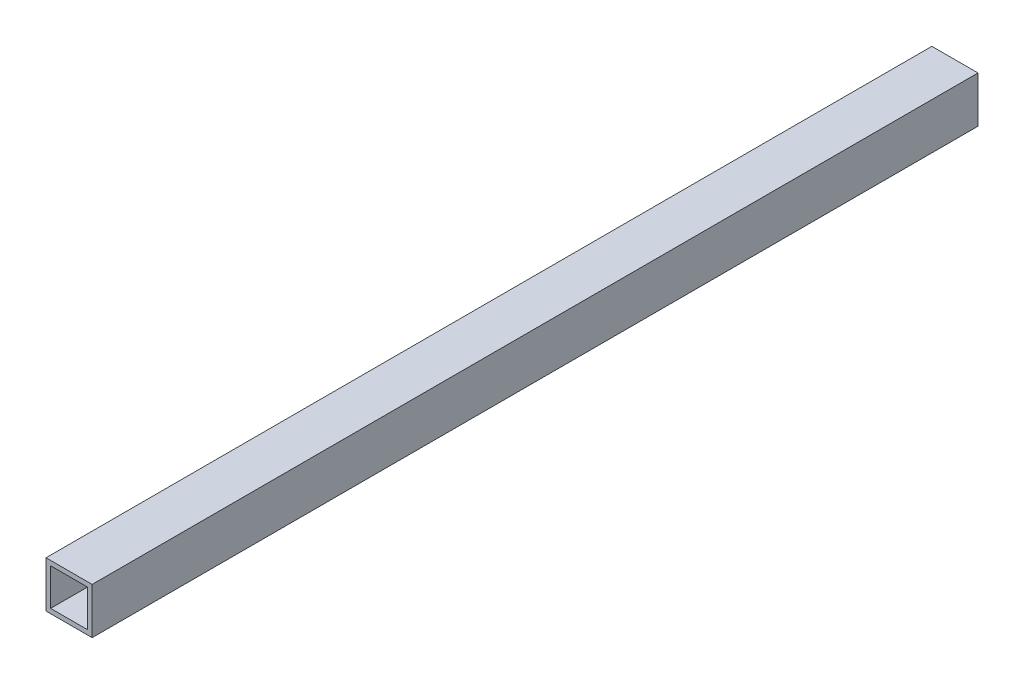
ISO-10303-21;
HEADER;
FILE_DESCRIPTION(('STEP AP214'),'2;1');
FILE_NAME('part.step','',(''),(''),'','','');
FILE_SCHEMA(('AUTOMOTIVE_DESIGN { 1 0 10303 214 1 1 1 1 }'));
ENDSEC;
DATA;
#1=APPLICATION_CONTEXT('core data for automotive mechanical design processes');
#2=APPLICATION_PROTOCOL_DEFINITION('international standard','automotive_design',2000,#1);
#3=PRODUCT_CONTEXT('',#1,'mechanical');
#4=PRODUCT('Part','Part','',(#3));
#5=PRODUCT_RELATED_PRODUCT_CATEGORY('part','',(#4));
#6=PRODUCT_DEFINITION_FORMATION('','',#4);
#7=PRODUCT_DEFINITION_CONTEXT('part definition',#1,'design');
#8=PRODUCT_DEFINITION('design','',#6,#7);
#9=PRODUCT_DEFINITION_SHAPE('','',#8);
#10=(LENGTH_UNIT() NAMED_UNIT(*) SI_UNIT(.MILLI.,.METRE.));
#11=(NAMED_UNIT(*) PLANE_ANGLE_UNIT() SI_UNIT($,.RADIAN.));
#12=(NAMED_UNIT(*) SI_UNIT($,.STERADIAN.) SOLID_ANGLE_UNIT());
#13=UNCERTAINTY_MEASURE_WITH_UNIT(LENGTH_MEASURE(1.E-05),#10,'distance_accuracy_value','');
#14=(GEOMETRIC_REPRESENTATION_CONTEXT(3) GLOBAL_UNCERTAINTY_ASSIGNED_CONTEXT((#13)) GLOBAL_UNIT_ASSIGNED_CONTEXT((#10,
#11,#12)) REPRESENTATION_CONTEXT('',''));
#15=CARTESIAN_POINT('',(0.,0.,0.));
#16=DIRECTION('',(0.,0.,1.));
#17=DIRECTION('',(1.,0.,0.));
#18=AXIS2_PLACEMENT_3D('',#15,#16,#17);
#19=CARTESIAN_POINT('',(31.75,31.75,0.));
#20=DIRECTION('',(0.,1.,0.));
#21=DIRECTION('',(0.,0.,1.));
#22=AXIS2_PLACEMENT_3D('',#19,#20,#21);
#23=PLANE('',#22);
#24=DIRECTION('',(0.,0.,-1.));
#25=VECTOR('',#24,1.);
#26=CARTESIAN_POINT('',(31.75,31.75,0.));
#27=LINE('',#26,#25);
#28=CARTESIAN_POINT('',(31.75,31.75,0.));
#29=VERTEX_POINT('',#28);
#30=CARTESIAN_POINT('',(31.75,31.75,609.6));
#31=VERTEX_POINT('',#30);
#32=EDGE_CURVE('E113',#29,#31,#27,.F.);
#33=ORIENTED_EDGE('',*,*,#32,.F.);
#34=DIRECTION('',(1.,0.,0.));
#35=VECTOR('',#34,1.);
#36=CARTESIAN_POINT('',(0.,31.75,0.));
#37=LINE('',#36,#35);
#38=CARTESIAN_POINT('',(0.,31.75,0.));
#39=VERTEX_POINT('',#38);
#40=EDGE_CURVE('E135',#29,#39,#37,.F.);
#41=ORIENTED_EDGE('',*,*,#40,.T.);
#42=DIRECTION('',(0.,0.,1.));
#43=VECTOR('',#42,1.);
#44=CARTESIAN_POINT('',(0.,31.75,0.));
#45=LINE('',#44,#43);
#46=CARTESIAN_POINT('',(0.,31.75,609.6));
#47=VERTEX_POINT('',#46);
#48=EDGE_CURVE('E143',#47,#39,#45,.F.);
#49=ORIENTED_EDGE('',*,*,#48,.F.);
#50=DIRECTION('',(1.,0.,0.));
#51=VECTOR('',#50,1.);
#52=CARTESIAN_POINT('',(0.,31.75,609.6));
#53=LINE('',#52,#51);
#54=EDGE_CURVE('E105',#31,#47,#53,.F.);
#55=ORIENTED_EDGE('',*,*,#54,.F.);
#56=EDGE_LOOP('',(#33,#41,#49,#55));
#57=FACE_BOUND('',#56,.T.);
#58=ADVANCED_FACE('F17',(#57),#23,.T.);
#59=CARTESIAN_POINT('',(0.,3.175,0.));
#60=DIRECTION('',(0.,-1.,0.));
#61=DIRECTION('',(0.,0.,-1.));
#62=AXIS2_PLACEMENT_3D('',#59,#60,#61);
#63=PLANE('',#62);
#64=DIRECTION('',(1.,0.,0.));
#65=VECTOR('',#64,1.);
#66=CARTESIAN_POINT('',(0.,3.175,609.6));
#67=LINE('',#66,#65);
#68=CARTESIAN_POINT('',(28.575,3.175,609.6));
#69=VERTEX_POINT('',#68);
#70=CARTESIAN_POINT('',(3.175,3.175,609.6));
#71=VERTEX_POINT('',#70);
#72=EDGE_CURVE('E104',#69,#71,#67,.F.);
#73=ORIENTED_EDGE('',*,*,#72,.F.);
#74=DIRECTION('',(0.,0.,-1.));
#75=VECTOR('',#74,1.);
#76=CARTESIAN_POINT('',(28.575,3.175,0.));
#77=LINE('',#76,#75);
#78=CARTESIAN_POINT('',(28.575,3.175,0.));
#79=VERTEX_POINT('',#78);
#80=EDGE_CURVE('E116',#69,#79,#77,.T.);
#81=ORIENTED_EDGE('',*,*,#80,.T.);
#82=DIRECTION('',(1.,0.,0.));
#83=VECTOR('',#82,1.);
#84=CARTESIAN_POINT('',(0.,3.175,0.));
#85=LINE('',#84,#83);
#86=CARTESIAN_POINT('',(3.175,3.175,0.));
#87=VERTEX_POINT('',#86);
#88=EDGE_CURVE('E122',#79,#87,#85,.F.);
#89=ORIENTED_EDGE('',*,*,#88,.T.);
#90=DIRECTION('',(0.,0.,1.));
#91=VECTOR('',#90,1.);
#92=CARTESIAN_POINT('',(3.175,3.175,0.));
#93=LINE('',#92,#91);
#94=EDGE_CURVE('E20',#87,#71,#93,.T.);
#95=ORIENTED_EDGE('',*,*,#94,.T.);
#96=EDGE_LOOP('',(#73,#81,#89,#95));
#97=FACE_BOUND('',#96,.T.);
#98=ADVANCED_FACE('F120',(#97),#63,.F.);
#99=CARTESIAN_POINT('',(3.175,31.75,0.));
#100=DIRECTION('',(-1.,0.,0.));
#101=DIRECTION('',(0.,0.,1.));
#102=AXIS2_PLACEMENT_3D('',#99,#100,#101);
#103=PLANE('',#102);
#104=DIRECTION('',(0.,1.,0.));
#105=VECTOR('',#104,1.);
#106=CARTESIAN_POINT('',(3.175,0.,609.6));
#107=LINE('',#106,#105);
#108=CARTESIAN_POINT('',(3.175,28.575,609.6));
#109=VERTEX_POINT('',#108);
#110=EDGE_CURVE('E85',#71,#109,#107,.T.);
#111=ORIENTED_EDGE('',*,*,#110,.F.);
#112=ORIENTED_EDGE('',*,*,#94,.F.);
#113=DIRECTION('',(0.,1.,0.));
#114=VECTOR('',#113,1.);
#115=CARTESIAN_POINT('',(3.175,0.,0.));
#116=LINE('',#115,#114);
#117=CARTESIAN_POINT('',(3.175,28.575,0.));
#118=VERTEX_POINT('',#117);
#119=EDGE_CURVE('E88',#87,#118,#116,.T.);
#120=ORIENTED_EDGE('',*,*,#119,.T.);
#121=DIRECTION('',(0.,0.,1.));
#122=VECTOR('',#121,1.);
#123=CARTESIAN_POINT('',(3.175,28.575,0.));
#124=LINE('',#123,#122);
#125=EDGE_CURVE('E80',#118,#109,#124,.T.);
#126=ORIENTED_EDGE('',*,*,#125,.T.);
#127=EDGE_LOOP('',(#111,#112,#120,#126));
#128=FACE_BOUND('',#127,.T.);
#129=ADVANCED_FACE('F82',(#128),#103,.F.);
#130=CARTESIAN_POINT('',(31.75,28.575,0.));
#131=DIRECTION('',(0.,1.,0.));
#132=DIRECTION('',(0.,0.,1.));
#133=AXIS2_PLACEMENT_3D('',#130,#131,#132);
#134=PLANE('',#133);
#135=DIRECTION('',(1.,0.,0.));
#136=VECTOR('',#135,1.);
#137=CARTESIAN_POINT('',(0.,28.575,609.6));
#138=LINE('',#137,#136);
#139=CARTESIAN_POINT('',(28.575,28.575,609.6));
#140=VERTEX_POINT('',#139);
#141=EDGE_CURVE('E93',#109,#140,#138,.T.);
#142=ORIENTED_EDGE('',*,*,#141,.F.);
#143=ORIENTED_EDGE('',*,*,#125,.F.);
#144=DIRECTION('',(1.,0.,0.));
#145=VECTOR('',#144,1.);
#146=CARTESIAN_POINT('',(0.,28.575,0.));
#147=LINE('',#146,#145);
#148=CARTESIAN_POINT('',(28.575,28.575,0.));
#149=VERTEX_POINT('',#148);
#150=EDGE_CURVE('E129',#118,#149,#147,.T.);
#151=ORIENTED_EDGE('',*,*,#150,.T.);
#152=DIRECTION('',(0.,0.,-1.));
#153=VECTOR('',#152,1.);
#154=CARTESIAN_POINT('',(28.575,28.575,0.));
#155=LINE('',#154,#153);
#156=EDGE_CURVE('E91',#149,#140,#155,.F.);
#157=ORIENTED_EDGE('',*,*,#156,.T.);
#158=EDGE_LOOP('',(#142,#143,#151,#157));
#159=FACE_BOUND('',#158,.T.);
#160=ADVANCED_FACE('F94',(#159),#134,.F.);
#161=CARTESIAN_POINT('',(28.575,0.,0.));
#162=DIRECTION('',(1.,0.,0.));
#163=DIRECTION('',(0.,0.,-1.));
#164=AXIS2_PLACEMENT_3D('',#161,#162,#163);
#165=PLANE('',#164);
#166=DIRECTION('',(0.,1.,0.));
#167=VECTOR('',#166,1.);
#168=CARTESIAN_POINT('',(28.575,0.,609.6));
#169=LINE('',#168,#167);
#170=EDGE_CURVE('E99',#140,#69,#169,.F.);
#171=ORIENTED_EDGE('',*,*,#170,.F.);
#172=ORIENTED_EDGE('',*,*,#156,.F.);
#173=DIRECTION('',(0.,1.,0.));
#174=VECTOR('',#173,1.);
#175=CARTESIAN_POINT('',(28.575,0.,0.));
#176=LINE('',#175,#174);
#177=EDGE_CURVE('E125',#149,#79,#176,.F.);
#178=ORIENTED_EDGE('',*,*,#177,.T.);
#179=ORIENTED_EDGE('',*,*,#80,.F.);
#180=EDGE_LOOP('',(#171,#172,#178,#179));
#181=FACE_BOUND('',#180,.T.);
#182=ADVANCED_FACE('F126',(#181),#165,.F.);
#183=CARTESIAN_POINT('',(31.75,0.,0.));
#184=DIRECTION('',(1.,0.,0.));
#185=DIRECTION('',(0.,0.,-1.));
#186=AXIS2_PLACEMENT_3D('',#183,#184,#185);
#187=PLANE('',#186);
#188=DIRECTION('',(0.,0.,-1.));
#189=VECTOR('',#188,1.);
#190=CARTESIAN_POINT('',(31.75,0.,0.));
#191=LINE('',#190,#189);
#192=CARTESIAN_POINT('',(31.75,0.,0.));
#193=VERTEX_POINT('',#192);
#194=CARTESIAN_POINT('',(31.75,0.,609.6));
#195=VERTEX_POINT('',#194);
#196=EDGE_CURVE('E128',#193,#195,#191,.F.);
#197=ORIENTED_EDGE('',*,*,#196,.F.);
#198=DIRECTION('',(0.,1.,0.));
#199=VECTOR('',#198,1.);
#200=CARTESIAN_POINT('',(31.75,0.,0.));
#201=LINE('',#200,#199);
#202=EDGE_CURVE('E140',#193,#29,#201,.T.);
#203=ORIENTED_EDGE('',*,*,#202,.T.);
#204=ORIENTED_EDGE('',*,*,#32,.T.);
#205=DIRECTION('',(0.,1.,0.));
#206=VECTOR('',#205,1.);
#207=CARTESIAN_POINT('',(31.75,0.,609.6));
#208=LINE('',#207,#206);
#209=EDGE_CURVE('E107',#195,#31,#208,.T.);
#210=ORIENTED_EDGE('',*,*,#209,.F.);
#211=EDGE_LOOP('',(#197,#203,#204,#210));
#212=FACE_BOUND('',#211,.T.);
#213=ADVANCED_FACE('F165',(#212),#187,.T.);
#214=CARTESIAN_POINT('',(0.,0.,609.6));
#215=DIRECTION('',(0.,0.,1.));
#216=DIRECTION('',(1.,0.,0.));
#217=AXIS2_PLACEMENT_3D('',#214,#215,#216);
#218=PLANE('',#217);
#219=ORIENTED_EDGE('',*,*,#170,.T.);
#220=ORIENTED_EDGE('',*,*,#72,.T.);
#221=ORIENTED_EDGE('',*,*,#110,.T.);
#222=ORIENTED_EDGE('',*,*,#141,.T.);
#223=EDGE_LOOP('',(#219,#220,#221,#222));
#224=FACE_BOUND('',#223,.T.);
#225=DIRECTION('',(0.,1.,0.));
#226=VECTOR('',#225,1.);
#227=CARTESIAN_POINT('',(0.,31.75,609.6));
#228=LINE('',#227,#226);
#229=CARTESIAN_POINT('',(0.,0.,609.6));
#230=VERTEX_POINT('',#229);
#231=EDGE_CURVE('E145',#230,#47,#228,.T.);
#232=ORIENTED_EDGE('',*,*,#231,.F.);
#233=DIRECTION('',(1.,0.,0.));
#234=VECTOR('',#233,1.);
#235=CARTESIAN_POINT('',(0.,0.,609.6));
#236=LINE('',#235,#234);
#237=EDGE_CURVE('E153',#195,#230,#236,.F.);
#238=ORIENTED_EDGE('',*,*,#237,.F.);
#239=ORIENTED_EDGE('',*,*,#209,.T.);
#240=ORIENTED_EDGE('',*,*,#54,.T.);
#241=EDGE_LOOP('',(#232,#238,#239,#240));
#242=FACE_BOUND('',#241,.T.);
#243=ADVANCED_FACE('F101',(#224,#242),#218,.T.);
#244=CARTESIAN_POINT('',(0.,31.75,0.));
#245=DIRECTION('',(-1.,0.,0.));
#246=DIRECTION('',(0.,0.,1.));
#247=AXIS2_PLACEMENT_3D('',#244,#245,#246);
#248=PLANE('',#247);
#249=ORIENTED_EDGE('',*,*,#48,.T.);
#250=DIRECTION('',(0.,1.,0.));
#251=VECTOR('',#250,1.);
#252=CARTESIAN_POINT('',(0.,0.,0.));
#253=LINE('',#252,#251);
#254=CARTESIAN_POINT('',(0.,0.,0.));
#255=VERTEX_POINT('',#254);
#256=EDGE_CURVE('E35',#39,#255,#253,.F.);
#257=ORIENTED_EDGE('',*,*,#256,.T.);
#258=DIRECTION('',(0.,0.,-1.));
#259=VECTOR('',#258,1.);
#260=CARTESIAN_POINT('',(0.,0.,0.));
#261=LINE('',#260,#259);
#262=EDGE_CURVE('E26',#230,#255,#261,.T.);
#263=ORIENTED_EDGE('',*,*,#262,.F.);
#264=ORIENTED_EDGE('',*,*,#231,.T.);
#265=EDGE_LOOP('',(#249,#257,#263,#264));
#266=FACE_BOUND('',#265,.T.);
#267=ADVANCED_FACE('F148',(#266),#248,.T.);
#268=CARTESIAN_POINT('',(0.,0.,0.));
#269=DIRECTION('',(0.,0.,1.));
#270=DIRECTION('',(1.,0.,0.));
#271=AXIS2_PLACEMENT_3D('',#268,#269,#270);
#272=PLANE('',#271);
#273=ORIENTED_EDGE('',*,*,#150,.F.);
#274=ORIENTED_EDGE('',*,*,#119,.F.);
#275=ORIENTED_EDGE('',*,*,#88,.F.);
#276=ORIENTED_EDGE('',*,*,#177,.F.);
#277=EDGE_LOOP('',(#273,#274,#275,#276));
#278=FACE_BOUND('',#277,.T.);
#279=ORIENTED_EDGE('',*,*,#40,.F.);
#280=ORIENTED_EDGE('',*,*,#202,.F.);
#281=DIRECTION('',(1.,0.,0.));
#282=VECTOR('',#281,1.);
#283=CARTESIAN_POINT('',(0.,0.,0.));
#284=LINE('',#283,#282);
#285=EDGE_CURVE('E11',#255,#193,#284,.T.);
#286=ORIENTED_EDGE('',*,*,#285,.F.);
#287=ORIENTED_EDGE('',*,*,#256,.F.);
#288=EDGE_LOOP('',(#279,#280,#286,#287));
#289=FACE_BOUND('',#288,.T.);
#290=ADVANCED_FACE('F131',(#278,#289),#272,.F.);
#291=CARTESIAN_POINT('',(0.,0.,0.));
#292=DIRECTION('',(0.,-1.,0.));
#293=DIRECTION('',(0.,0.,-1.));
#294=AXIS2_PLACEMENT_3D('',#291,#292,#293);
#295=PLANE('',#294);
#296=ORIENTED_EDGE('',*,*,#262,.T.);
#297=ORIENTED_EDGE('',*,*,#285,.T.);
#298=ORIENTED_EDGE('',*,*,#196,.T.);
#299=ORIENTED_EDGE('',*,*,#237,.T.);
#300=EDGE_LOOP('',(#296,#297,#298,#299));
#301=FACE_BOUND('',#300,.T.);
#302=ADVANCED_FACE('F160',(#301),#295,.T.);
#303=CLOSED_SHELL('',(#58,#98,#129,#160,#182,#213,#243,#267,#290,#302));
#304=MANIFOLD_SOLID_BREP('B1',#303);
#305=ADVANCED_BREP_SHAPE_REPRESENTATION('',(#18,#304),#14);
#306=SHAPE_DEFINITION_REPRESENTATION(#9,#305);
ENDSEC;
END-ISO-10303-21;
